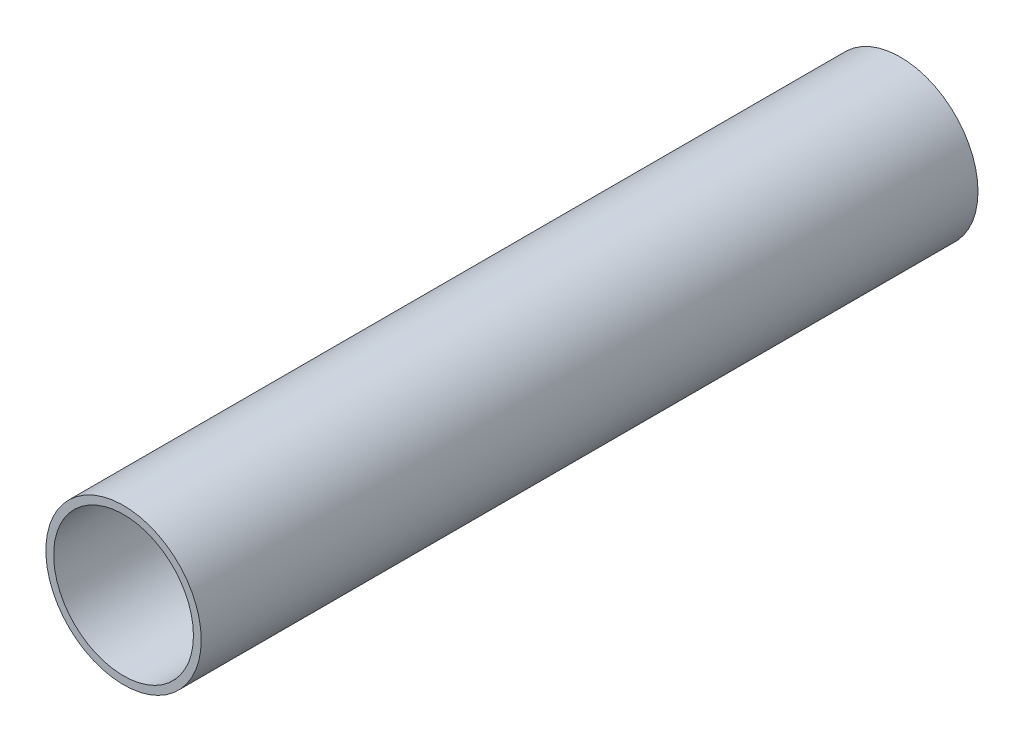
ISO-10303-21;
HEADER;
FILE_DESCRIPTION(('STEP AP214'),'2;1');
FILE_NAME('part.step','',(''),(''),'','','');
FILE_SCHEMA(('AUTOMOTIVE_DESIGN { 1 0 10303 214 1 1 1 1 }'));
ENDSEC;
DATA;
#1=APPLICATION_CONTEXT('core data for automotive mechanical design processes');
#2=APPLICATION_PROTOCOL_DEFINITION('international standard','automotive_design',2000,#1);
#3=PRODUCT_CONTEXT('',#1,'mechanical');
#4=PRODUCT('Part','Part','',(#3));
#5=PRODUCT_RELATED_PRODUCT_CATEGORY('part','',(#4));
#6=PRODUCT_DEFINITION_FORMATION('','',#4);
#7=PRODUCT_DEFINITION_CONTEXT('part definition',#1,'design');
#8=PRODUCT_DEFINITION('design','',#6,#7);
#9=PRODUCT_DEFINITION_SHAPE('','',#8);
#10=(LENGTH_UNIT() NAMED_UNIT(*) SI_UNIT(.MILLI.,.METRE.));
#11=(NAMED_UNIT(*) PLANE_ANGLE_UNIT() SI_UNIT($,.RADIAN.));
#12=(NAMED_UNIT(*) SI_UNIT($,.STERADIAN.) SOLID_ANGLE_UNIT());
#13=UNCERTAINTY_MEASURE_WITH_UNIT(LENGTH_MEASURE(1.E-05),#10,'distance_accuracy_value','');
#14=(GEOMETRIC_REPRESENTATION_CONTEXT(3) GLOBAL_UNCERTAINTY_ASSIGNED_CONTEXT((#13)) GLOBAL_UNIT_ASSIGNED_CONTEXT((#10,
#11,#12)) REPRESENTATION_CONTEXT('',''));
#15=CARTESIAN_POINT('',(0.,0.,0.));
#16=DIRECTION('',(0.,0.,1.));
#17=DIRECTION('',(1.,0.,0.));
#18=AXIS2_PLACEMENT_3D('',#15,#16,#17);
#19=CARTESIAN_POINT('',(0.,0.,500.));
#20=DIRECTION('',(0.,0.,1.));
#21=DIRECTION('',(1.,0.,0.));
#22=AXIS2_PLACEMENT_3D('',#19,#20,#21);
#23=PLANE('',#22);
#24=CARTESIAN_POINT('',(0.,0.,500.));
#25=DIRECTION('',(0.,0.,1.));
#26=DIRECTION('',(1.,0.,0.));
#27=AXIS2_PLACEMENT_3D('',#24,#25,#26);
#28=CIRCLE('',#27,50.);
#29=CARTESIAN_POINT('',(50.,0.,500.));
#30=VERTEX_POINT('',#29);
#31=EDGE_CURVE('E10',#30,#30,#28,.T.);
#32=ORIENTED_EDGE('',*,*,#31,.T.);
#33=EDGE_LOOP('',(#32));
#34=FACE_BOUND('',#33,.T.);
#35=CARTESIAN_POINT('',(0.,0.,500.));
#36=DIRECTION('',(0.,0.,1.));
#37=DIRECTION('',(1.,0.,0.));
#38=AXIS2_PLACEMENT_3D('',#35,#36,#37);
#39=CIRCLE('',#38,45.);
#40=CARTESIAN_POINT('',(45.,0.,500.));
#41=VERTEX_POINT('',#40);
#42=EDGE_CURVE('E45',#41,#41,#39,.T.);
#43=ORIENTED_EDGE('',*,*,#42,.F.);
#44=EDGE_LOOP('',(#43));
#45=FACE_BOUND('',#44,.T.);
#46=ADVANCED_FACE('F34',(#34,#45),#23,.T.);
#47=CARTESIAN_POINT('',(0.,0.,0.));
#48=DIRECTION('',(0.,0.,1.));
#49=DIRECTION('',(1.,0.,0.));
#50=AXIS2_PLACEMENT_3D('',#47,#48,#49);
#51=PLANE('',#50);
#52=CARTESIAN_POINT('',(0.,0.,0.));
#53=DIRECTION('',(0.,0.,1.));
#54=DIRECTION('',(1.,0.,0.));
#55=AXIS2_PLACEMENT_3D('',#52,#53,#54);
#56=CIRCLE('',#55,50.);
#57=CARTESIAN_POINT('',(50.,0.,0.));
#58=VERTEX_POINT('',#57);
#59=EDGE_CURVE('E38',#58,#58,#56,.T.);
#60=ORIENTED_EDGE('',*,*,#59,.F.);
#61=EDGE_LOOP('',(#60));
#62=FACE_BOUND('',#61,.T.);
#63=CARTESIAN_POINT('',(0.,0.,0.));
#64=DIRECTION('',(0.,0.,1.));
#65=DIRECTION('',(1.,0.,0.));
#66=AXIS2_PLACEMENT_3D('',#63,#64,#65);
#67=CIRCLE('',#66,45.);
#68=CARTESIAN_POINT('',(45.,0.,0.));
#69=VERTEX_POINT('',#68);
#70=EDGE_CURVE('E47',#69,#69,#67,.T.);
#71=ORIENTED_EDGE('',*,*,#70,.T.);
#72=EDGE_LOOP('',(#71));
#73=FACE_BOUND('',#72,.T.);
#74=ADVANCED_FACE('F57',(#62,#73),#51,.F.);
#75=CARTESIAN_POINT('',(0.,0.,500.));
#76=DIRECTION('',(0.,0.,-1.));
#77=DIRECTION('',(-1.,0.,0.));
#78=AXIS2_PLACEMENT_3D('',#75,#76,#77);
#79=CYLINDRICAL_SURFACE('',#78,50.);
#80=ORIENTED_EDGE('',*,*,#31,.F.);
#81=EDGE_LOOP('',(#80));
#82=FACE_BOUND('',#81,.T.);
#83=ORIENTED_EDGE('',*,*,#59,.T.);
#84=EDGE_LOOP('',(#83));
#85=FACE_BOUND('',#84,.T.);
#86=ADVANCED_FACE('F36',(#82,#85),#79,.T.);
#87=CARTESIAN_POINT('',(0.,0.,500.));
#88=DIRECTION('',(0.,0.,-1.));
#89=DIRECTION('',(-1.,0.,0.));
#90=AXIS2_PLACEMENT_3D('',#87,#88,#89);
#91=CYLINDRICAL_SURFACE('',#90,45.);
#92=ORIENTED_EDGE('',*,*,#42,.T.);
#93=EDGE_LOOP('',(#92));
#94=FACE_BOUND('',#93,.T.);
#95=ORIENTED_EDGE('',*,*,#70,.F.);
#96=EDGE_LOOP('',(#95));
#97=FACE_BOUND('',#96,.T.);
#98=ADVANCED_FACE('F53',(#94,#97),#91,.F.);
#99=CLOSED_SHELL('',(#46,#74,#86,#98));
#100=MANIFOLD_SOLID_BREP('B2',#99);
#101=ADVANCED_BREP_SHAPE_REPRESENTATION('',(#18,#100),#14);
#102=SHAPE_DEFINITION_REPRESENTATION(#9,#101);
ENDSEC;
END-ISO-10303-21;
